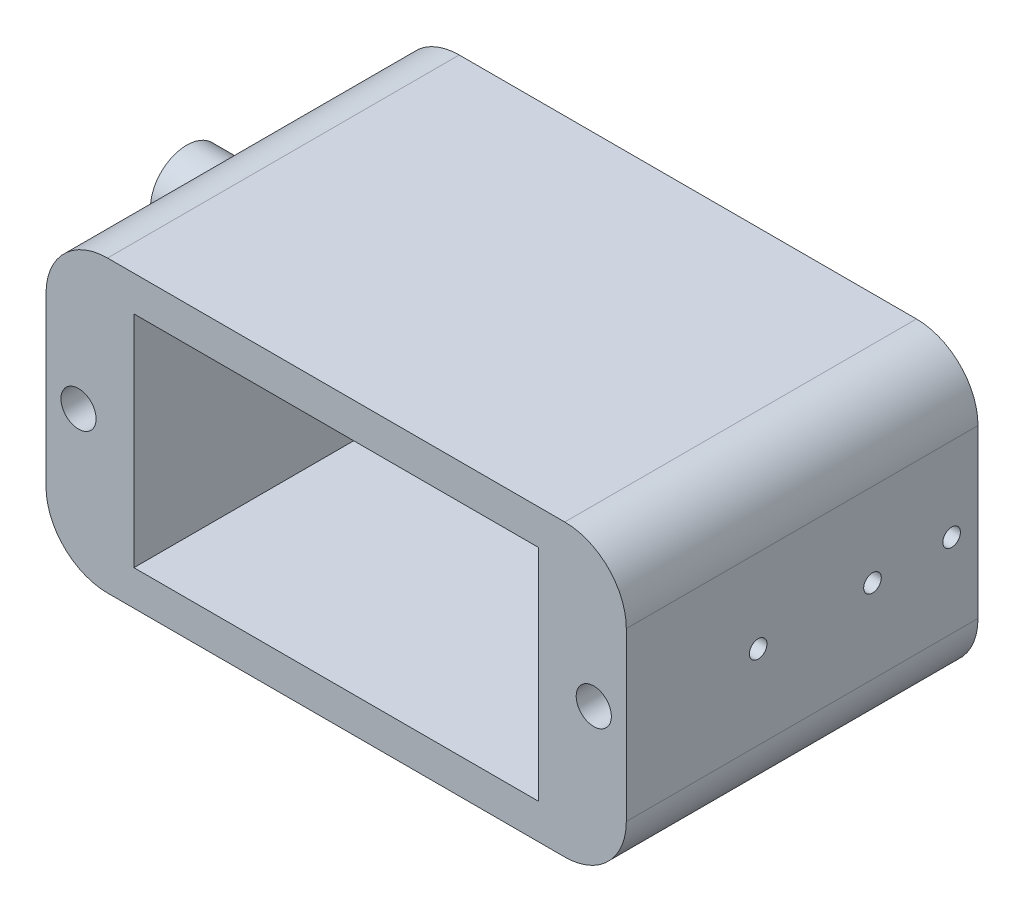
ISO-10303-21;
HEADER;
FILE_DESCRIPTION(('STEP AP214'),'2;1');
FILE_NAME('part.step','',(''),(''),'','','');
FILE_SCHEMA(('AUTOMOTIVE_DESIGN { 1 0 10303 214 1 1 1 1 }'));
ENDSEC;
DATA;
#1=APPLICATION_CONTEXT('core data for automotive mechanical design processes');
#2=APPLICATION_PROTOCOL_DEFINITION('international standard','automotive_design',2000,#1);
#3=PRODUCT_CONTEXT('',#1,'mechanical');
#4=PRODUCT('Part','Part','',(#3));
#5=PRODUCT_RELATED_PRODUCT_CATEGORY('part','',(#4));
#6=PRODUCT_DEFINITION_FORMATION('','',#4);
#7=PRODUCT_DEFINITION_CONTEXT('part definition',#1,'design');
#8=PRODUCT_DEFINITION('design','',#6,#7);
#9=PRODUCT_DEFINITION_SHAPE('','',#8);
#10=(LENGTH_UNIT() NAMED_UNIT(*) SI_UNIT(.MILLI.,.METRE.));
#11=(NAMED_UNIT(*) PLANE_ANGLE_UNIT() SI_UNIT($,.RADIAN.));
#12=(NAMED_UNIT(*) SI_UNIT($,.STERADIAN.) SOLID_ANGLE_UNIT());
#13=UNCERTAINTY_MEASURE_WITH_UNIT(LENGTH_MEASURE(1.E-05),#10,'distance_accuracy_value','');
#14=(GEOMETRIC_REPRESENTATION_CONTEXT(3) GLOBAL_UNCERTAINTY_ASSIGNED_CONTEXT((#13)) GLOBAL_UNIT_ASSIGNED_CONTEXT((#10,
#11,#12)) REPRESENTATION_CONTEXT('',''));
#15=CARTESIAN_POINT('',(0.,0.,0.));
#16=DIRECTION('',(0.,0.,1.));
#17=DIRECTION('',(1.,0.,0.));
#18=AXIS2_PLACEMENT_3D('',#15,#16,#17);
#19=CARTESIAN_POINT('',(0.,0.,16.));
#20=DIRECTION('',(0.,0.,-1.));
#21=DIRECTION('',(-1.,0.,0.));
#22=AXIS2_PLACEMENT_3D('',#19,#20,#21);
#23=PLANE('',#22);
#24=CARTESIAN_POINT('',(-14.65,0.,16.));
#25=DIRECTION('',(0.,0.,1.));
#26=DIRECTION('',(1.,0.,0.));
#27=AXIS2_PLACEMENT_3D('',#24,#25,#26);
#28=CIRCLE('',#27,1.);
#29=CARTESIAN_POINT('',(-13.65,0.,16.));
#30=VERTEX_POINT('',#29);
#31=EDGE_CURVE('E250',#30,#30,#28,.T.);
#32=ORIENTED_EDGE('',*,*,#31,.F.);
#33=EDGE_LOOP('',(#32));
#34=FACE_BOUND('',#33,.T.);
#35=CARTESIAN_POINT('',(14.65,0.,16.));
#36=DIRECTION('',(0.,0.,1.));
#37=DIRECTION('',(-1.,0.,0.));
#38=AXIS2_PLACEMENT_3D('',#35,#36,#37);
#39=CIRCLE('',#38,1.);
#40=CARTESIAN_POINT('',(13.65,0.,16.));
#41=VERTEX_POINT('',#40);
#42=EDGE_CURVE('E244',#41,#41,#39,.T.);
#43=ORIENTED_EDGE('',*,*,#42,.F.);
#44=EDGE_LOOP('',(#43));
#45=FACE_BOUND('',#44,.T.);
#46=DIRECTION('',(0.,1.,0.));
#47=VECTOR('',#46,1.);
#48=CARTESIAN_POINT('',(16.5,-8.25,16.));
#49=LINE('',#48,#47);
#50=CARTESIAN_POINT('',(16.5,-4.75,16.));
#51=VERTEX_POINT('',#50);
#52=CARTESIAN_POINT('',(16.5,4.75,16.));
#53=VERTEX_POINT('',#52);
#54=EDGE_CURVE('E306',#51,#53,#49,.T.);
#55=ORIENTED_EDGE('',*,*,#54,.T.);
#56=CARTESIAN_POINT('',(13.,4.75,16.));
#57=DIRECTION('',(0.,0.,-1.));
#58=DIRECTION('',(-1.,0.,0.));
#59=AXIS2_PLACEMENT_3D('',#56,#57,#58);
#60=CIRCLE('',#59,3.5);
#61=CARTESIAN_POINT('',(13.,8.25,16.));
#62=VERTEX_POINT('',#61);
#63=EDGE_CURVE('E365',#53,#62,#60,.F.);
#64=ORIENTED_EDGE('',*,*,#63,.T.);
#65=DIRECTION('',(-1.,0.,0.));
#66=VECTOR('',#65,1.);
#67=CARTESIAN_POINT('',(-16.5,8.25,16.));
#68=LINE('',#67,#66);
#69=CARTESIAN_POINT('',(-13.,8.25,16.));
#70=VERTEX_POINT('',#69);
#71=EDGE_CURVE('E310',#62,#70,#68,.T.);
#72=ORIENTED_EDGE('',*,*,#71,.T.);
#73=CARTESIAN_POINT('',(-13.,4.75,16.));
#74=DIRECTION('',(0.,0.,-1.));
#75=DIRECTION('',(-1.,0.,0.));
#76=AXIS2_PLACEMENT_3D('',#73,#74,#75);
#77=CIRCLE('',#76,3.5);
#78=CARTESIAN_POINT('',(-16.5,4.75,16.));
#79=VERTEX_POINT('',#78);
#80=EDGE_CURVE('E362',#70,#79,#77,.F.);
#81=ORIENTED_EDGE('',*,*,#80,.T.);
#82=DIRECTION('',(0.,-1.,0.));
#83=VECTOR('',#82,1.);
#84=CARTESIAN_POINT('',(-16.5,-8.25,16.));
#85=LINE('',#84,#83);
#86=CARTESIAN_POINT('',(-16.5,-4.75,16.));
#87=VERTEX_POINT('',#86);
#88=EDGE_CURVE('E314',#79,#87,#85,.T.);
#89=ORIENTED_EDGE('',*,*,#88,.T.);
#90=CARTESIAN_POINT('',(-13.,-4.75,16.));
#91=DIRECTION('',(0.,0.,-1.));
#92=DIRECTION('',(-1.,0.,0.));
#93=AXIS2_PLACEMENT_3D('',#90,#91,#92);
#94=CIRCLE('',#93,3.5);
#95=CARTESIAN_POINT('',(-13.,-8.25,16.));
#96=VERTEX_POINT('',#95);
#97=EDGE_CURVE('E60',#87,#96,#94,.F.);
#98=ORIENTED_EDGE('',*,*,#97,.T.);
#99=DIRECTION('',(1.,0.,0.));
#100=VECTOR('',#99,1.);
#101=CARTESIAN_POINT('',(-16.5,-8.25,16.));
#102=LINE('',#101,#100);
#103=CARTESIAN_POINT('',(13.,-8.25,16.));
#104=VERTEX_POINT('',#103);
#105=EDGE_CURVE('E317',#96,#104,#102,.T.);
#106=ORIENTED_EDGE('',*,*,#105,.T.);
#107=CARTESIAN_POINT('',(13.,-4.75,16.));
#108=DIRECTION('',(0.,0.,-1.));
#109=DIRECTION('',(-1.,0.,0.));
#110=AXIS2_PLACEMENT_3D('',#107,#108,#109);
#111=CIRCLE('',#110,3.5);
#112=EDGE_CURVE('E357',#104,#51,#111,.F.);
#113=ORIENTED_EDGE('',*,*,#112,.T.);
#114=EDGE_LOOP('',(#55,#64,#72,#81,#89,#98,#106,#113));
#115=FACE_BOUND('',#114,.T.);
#116=DIRECTION('',(0.,1.,0.));
#117=VECTOR('',#116,1.);
#118=CARTESIAN_POINT('',(11.5,-6.25,16.));
#119=LINE('',#118,#117);
#120=CARTESIAN_POINT('',(11.5,-6.25,16.));
#121=VERTEX_POINT('',#120);
#122=CARTESIAN_POINT('',(11.5,6.25,16.));
#123=VERTEX_POINT('',#122);
#124=EDGE_CURVE('E261',#121,#123,#119,.T.);
#125=ORIENTED_EDGE('',*,*,#124,.F.);
#126=DIRECTION('',(1.,0.,0.));
#127=VECTOR('',#126,1.);
#128=CARTESIAN_POINT('',(-11.5,-6.25,16.));
#129=LINE('',#128,#127);
#130=CARTESIAN_POINT('',(-11.5,-6.25,16.));
#131=VERTEX_POINT('',#130);
#132=EDGE_CURVE('E272',#131,#121,#129,.T.);
#133=ORIENTED_EDGE('',*,*,#132,.F.);
#134=DIRECTION('',(0.,-1.,0.));
#135=VECTOR('',#134,1.);
#136=CARTESIAN_POINT('',(-11.5,-6.25,16.));
#137=LINE('',#136,#135);
#138=CARTESIAN_POINT('',(-11.5,6.25,16.));
#139=VERTEX_POINT('',#138);
#140=EDGE_CURVE('E268',#139,#131,#137,.T.);
#141=ORIENTED_EDGE('',*,*,#140,.F.);
#142=DIRECTION('',(-1.,0.,0.));
#143=VECTOR('',#142,1.);
#144=CARTESIAN_POINT('',(-11.5,6.25,16.));
#145=LINE('',#144,#143);
#146=EDGE_CURVE('E264',#123,#139,#145,.T.);
#147=ORIENTED_EDGE('',*,*,#146,.F.);
#148=EDGE_LOOP('',(#125,#133,#141,#147));
#149=FACE_BOUND('',#148,.T.);
#150=ADVANCED_FACE('F38',(#34,#45,#115,#149),#23,.F.);
#151=CARTESIAN_POINT('',(16.5,-8.25,16.));
#152=DIRECTION('',(-1.,0.,0.));
#153=DIRECTION('',(0.,0.,1.));
#154=AXIS2_PLACEMENT_3D('',#151,#152,#153);
#155=PLANE('',#154);
#156=CARTESIAN_POINT('',(16.5,0.,8.5));
#157=DIRECTION('',(1.,0.,0.));
#158=DIRECTION('',(0.,0.,-1.));
#159=AXIS2_PLACEMENT_3D('',#156,#157,#158);
#160=CIRCLE('',#159,0.500000000000001);
#161=CARTESIAN_POINT('',(16.5,0.,8.));
#162=VERTEX_POINT('',#161);
#163=EDGE_CURVE('E759',#162,#162,#160,.T.);
#164=ORIENTED_EDGE('',*,*,#163,.F.);
#165=EDGE_LOOP('',(#164));
#166=FACE_BOUND('',#165,.T.);
#167=CARTESIAN_POINT('',(16.5,0.,-2.5));
#168=DIRECTION('',(1.,0.,0.));
#169=DIRECTION('',(0.,0.,-1.));
#170=AXIS2_PLACEMENT_3D('',#167,#168,#169);
#171=CIRCLE('',#170,0.5);
#172=CARTESIAN_POINT('',(16.5,0.,-3.));
#173=VERTEX_POINT('',#172);
#174=EDGE_CURVE('E751',#173,#173,#171,.T.);
#175=ORIENTED_EDGE('',*,*,#174,.F.);
#176=EDGE_LOOP('',(#175));
#177=FACE_BOUND('',#176,.T.);
#178=CARTESIAN_POINT('',(16.5,0.,2.));
#179=DIRECTION('',(1.,0.,0.));
#180=DIRECTION('',(0.,0.,-1.));
#181=AXIS2_PLACEMENT_3D('',#178,#179,#180);
#182=CIRCLE('',#181,0.500000000000001);
#183=CARTESIAN_POINT('',(16.5,0.,1.5));
#184=VERTEX_POINT('',#183);
#185=EDGE_CURVE('E195',#184,#184,#182,.T.);
#186=ORIENTED_EDGE('',*,*,#185,.F.);
#187=EDGE_LOOP('',(#186));
#188=FACE_BOUND('',#187,.T.);
#189=DIRECTION('',(0.,-1.,0.));
#190=VECTOR('',#189,1.);
#191=CARTESIAN_POINT('',(16.5,-8.25,-4.));
#192=LINE('',#191,#190);
#193=CARTESIAN_POINT('',(16.5,4.75,-4.));
#194=VERTEX_POINT('',#193);
#195=CARTESIAN_POINT('',(16.5,-4.75,-4.));
#196=VERTEX_POINT('',#195);
#197=EDGE_CURVE('E232',#194,#196,#192,.T.);
#198=ORIENTED_EDGE('',*,*,#197,.F.);
#199=DIRECTION('',(0.,0.,-1.));
#200=VECTOR('',#199,1.);
#201=CARTESIAN_POINT('',(16.5,4.75,16.));
#202=LINE('',#201,#200);
#203=EDGE_CURVE('E354',#194,#53,#202,.F.);
#204=ORIENTED_EDGE('',*,*,#203,.T.);
#205=ORIENTED_EDGE('',*,*,#54,.F.);
#206=DIRECTION('',(0.,0.,-1.));
#207=VECTOR('',#206,1.);
#208=CARTESIAN_POINT('',(16.5,-4.75,16.));
#209=LINE('',#208,#207);
#210=EDGE_CURVE('E350',#51,#196,#209,.T.);
#211=ORIENTED_EDGE('',*,*,#210,.T.);
#212=EDGE_LOOP('',(#198,#204,#205,#211));
#213=FACE_BOUND('',#212,.T.);
#214=ADVANCED_FACE('F423',(#166,#177,#188,#213),#155,.F.);
#215=CARTESIAN_POINT('',(-16.5,8.25,16.));
#216=DIRECTION('',(0.,-1.,0.));
#217=DIRECTION('',(0.,0.,-1.));
#218=AXIS2_PLACEMENT_3D('',#215,#216,#217);
#219=PLANE('',#218);
#220=ORIENTED_EDGE('',*,*,#71,.F.);
#221=DIRECTION('',(0.,0.,-1.));
#222=VECTOR('',#221,1.);
#223=CARTESIAN_POINT('',(13.,8.25,16.));
#224=LINE('',#223,#222);
#225=CARTESIAN_POINT('',(13.,8.25,-4.));
#226=VERTEX_POINT('',#225);
#227=EDGE_CURVE('E334',#62,#226,#224,.T.);
#228=ORIENTED_EDGE('',*,*,#227,.T.);
#229=DIRECTION('',(1.,0.,0.));
#230=VECTOR('',#229,1.);
#231=CARTESIAN_POINT('',(16.5,8.25,-4.));
#232=LINE('',#231,#230);
#233=CARTESIAN_POINT('',(-13.,8.25,-4.));
#234=VERTEX_POINT('',#233);
#235=EDGE_CURVE('E225',#234,#226,#232,.T.);
#236=ORIENTED_EDGE('',*,*,#235,.F.);
#237=DIRECTION('',(0.,0.,-1.));
#238=VECTOR('',#237,1.);
#239=CARTESIAN_POINT('',(-13.,8.25,16.));
#240=LINE('',#239,#238);
#241=EDGE_CURVE('E331',#234,#70,#240,.F.);
#242=ORIENTED_EDGE('',*,*,#241,.T.);
#243=EDGE_LOOP('',(#220,#228,#236,#242));
#244=FACE_BOUND('',#243,.T.);
#245=ADVANCED_FACE('F430',(#244),#219,.F.);
#246=CARTESIAN_POINT('',(-16.5,-8.25,16.));
#247=DIRECTION('',(1.,0.,0.));
#248=DIRECTION('',(0.,0.,-1.));
#249=AXIS2_PLACEMENT_3D('',#246,#247,#248);
#250=PLANE('',#249);
#251=CARTESIAN_POINT('',(-16.5,0.,2.));
#252=DIRECTION('',(1.,0.,0.));
#253=DIRECTION('',(0.,0.,-1.));
#254=AXIS2_PLACEMENT_3D('',#251,#252,#253);
#255=CIRCLE('',#254,2.06);
#256=CARTESIAN_POINT('',(-16.5,0.,-0.0600000000000002));
#257=VERTEX_POINT('',#256);
#258=EDGE_CURVE('E320',#257,#257,#255,.F.);
#259=ORIENTED_EDGE('',*,*,#258,.F.);
#260=EDGE_LOOP('',(#259));
#261=FACE_BOUND('',#260,.T.);
#262=ORIENTED_EDGE('',*,*,#88,.F.);
#263=DIRECTION('',(0.,0.,-1.));
#264=VECTOR('',#263,1.);
#265=CARTESIAN_POINT('',(-16.5,4.75,16.));
#266=LINE('',#265,#264);
#267=CARTESIAN_POINT('',(-16.5,4.75,-4.));
#268=VERTEX_POINT('',#267);
#269=EDGE_CURVE('E371',#79,#268,#266,.T.);
#270=ORIENTED_EDGE('',*,*,#269,.T.);
#271=DIRECTION('',(0.,1.,0.));
#272=VECTOR('',#271,1.);
#273=CARTESIAN_POINT('',(-16.5,8.25,-4.));
#274=LINE('',#273,#272);
#275=CARTESIAN_POINT('',(-16.5,-4.75,-4.));
#276=VERTEX_POINT('',#275);
#277=EDGE_CURVE('E240',#276,#268,#274,.T.);
#278=ORIENTED_EDGE('',*,*,#277,.F.);
#279=DIRECTION('',(0.,0.,-1.));
#280=VECTOR('',#279,1.);
#281=CARTESIAN_POINT('',(-16.5,-4.75,16.));
#282=LINE('',#281,#280);
#283=EDGE_CURVE('E368',#276,#87,#282,.F.);
#284=ORIENTED_EDGE('',*,*,#283,.T.);
#285=EDGE_LOOP('',(#262,#270,#278,#284));
#286=FACE_BOUND('',#285,.T.);
#287=ADVANCED_FACE('F440',(#261,#286),#250,.F.);
#288=CARTESIAN_POINT('',(-16.5,-8.25,16.));
#289=DIRECTION('',(0.,1.,0.));
#290=DIRECTION('',(0.,0.,1.));
#291=AXIS2_PLACEMENT_3D('',#288,#289,#290);
#292=PLANE('',#291);
#293=ORIENTED_EDGE('',*,*,#105,.F.);
#294=DIRECTION('',(0.,0.,-1.));
#295=VECTOR('',#294,1.);
#296=CARTESIAN_POINT('',(-13.,-8.25,16.));
#297=LINE('',#296,#295);
#298=CARTESIAN_POINT('',(-13.,-8.24999999999999,-4.));
#299=VERTEX_POINT('',#298);
#300=EDGE_CURVE('E11',#96,#299,#297,.T.);
#301=ORIENTED_EDGE('',*,*,#300,.T.);
#302=DIRECTION('',(-1.,0.,0.));
#303=VECTOR('',#302,1.);
#304=CARTESIAN_POINT('',(11.5,-8.25,-4.));
#305=LINE('',#304,#303);
#306=CARTESIAN_POINT('',(13.,-8.25,-4.));
#307=VERTEX_POINT('',#306);
#308=EDGE_CURVE('E236',#307,#299,#305,.T.);
#309=ORIENTED_EDGE('',*,*,#308,.F.);
#310=DIRECTION('',(0.,0.,-1.));
#311=VECTOR('',#310,1.);
#312=CARTESIAN_POINT('',(13.,-8.25,16.));
#313=LINE('',#312,#311);
#314=EDGE_CURVE('E47',#307,#104,#313,.F.);
#315=ORIENTED_EDGE('',*,*,#314,.T.);
#316=EDGE_LOOP('',(#293,#301,#309,#315));
#317=FACE_BOUND('',#316,.T.);
#318=ADVANCED_FACE('F437',(#317),#292,.F.);
#319=CARTESIAN_POINT('',(11.5,-6.25,16.));
#320=DIRECTION('',(-1.,0.,0.));
#321=DIRECTION('',(0.,0.,1.));
#322=AXIS2_PLACEMENT_3D('',#319,#320,#321);
#323=PLANE('',#322);
#324=DIRECTION('',(0.,0.,-1.));
#325=VECTOR('',#324,1.);
#326=CARTESIAN_POINT('',(11.5,5.,7.));
#327=LINE('',#326,#325);
#328=CARTESIAN_POINT('',(11.5,5.,7.));
#329=VERTEX_POINT('',#328);
#330=CARTESIAN_POINT('',(11.5,5.,0.));
#331=VERTEX_POINT('',#330);
#332=EDGE_CURVE('E215',#329,#331,#327,.T.);
#333=ORIENTED_EDGE('',*,*,#332,.F.);
#334=DIRECTION('',(0.,1.,0.));
#335=VECTOR('',#334,1.);
#336=CARTESIAN_POINT('',(11.5,5.,7.));
#337=LINE('',#336,#335);
#338=CARTESIAN_POINT('',(11.5,-5.,7.));
#339=VERTEX_POINT('',#338);
#340=EDGE_CURVE('E183',#339,#329,#337,.T.);
#341=ORIENTED_EDGE('',*,*,#340,.F.);
#342=DIRECTION('',(0.,0.,-1.));
#343=VECTOR('',#342,1.);
#344=CARTESIAN_POINT('',(11.5,-5.,7.));
#345=LINE('',#344,#343);
#346=CARTESIAN_POINT('',(11.5,-5.,0.));
#347=VERTEX_POINT('',#346);
#348=EDGE_CURVE('E179',#339,#347,#345,.T.);
#349=ORIENTED_EDGE('',*,*,#348,.T.);
#350=DIRECTION('',(0.,1.,0.));
#351=VECTOR('',#350,1.);
#352=CARTESIAN_POINT('',(11.5,-6.25,0.));
#353=LINE('',#352,#351);
#354=CARTESIAN_POINT('',(11.5,-6.25,0.));
#355=VERTEX_POINT('',#354);
#356=EDGE_CURVE('E276',#355,#347,#353,.T.);
#357=ORIENTED_EDGE('',*,*,#356,.F.);
#358=DIRECTION('',(0.,0.,-1.));
#359=VECTOR('',#358,1.);
#360=CARTESIAN_POINT('',(11.5,-6.25,16.));
#361=LINE('',#360,#359);
#362=EDGE_CURVE('E275',#121,#355,#361,.T.);
#363=ORIENTED_EDGE('',*,*,#362,.F.);
#364=ORIENTED_EDGE('',*,*,#124,.T.);
#365=DIRECTION('',(0.,0.,-1.));
#366=VECTOR('',#365,1.);
#367=CARTESIAN_POINT('',(11.5,6.25,16.));
#368=LINE('',#367,#366);
#369=CARTESIAN_POINT('',(11.5,6.25,0.));
#370=VERTEX_POINT('',#369);
#371=EDGE_CURVE('E302',#123,#370,#368,.T.);
#372=ORIENTED_EDGE('',*,*,#371,.T.);
#373=EDGE_CURVE('E249',#331,#370,#353,.T.);
#374=ORIENTED_EDGE('',*,*,#373,.F.);
#375=EDGE_LOOP('',(#333,#341,#349,#357,#363,#364,#372,#374));
#376=FACE_BOUND('',#375,.T.);
#377=ADVANCED_FACE('F393',(#376),#323,.T.);
#378=CARTESIAN_POINT('',(-11.5,6.25,16.));
#379=DIRECTION('',(0.,-1.,0.));
#380=DIRECTION('',(0.,0.,-1.));
#381=AXIS2_PLACEMENT_3D('',#378,#379,#380);
#382=PLANE('',#381);
#383=DIRECTION('',(-1.,0.,0.));
#384=VECTOR('',#383,1.);
#385=CARTESIAN_POINT('',(-11.5,6.25,0.));
#386=LINE('',#385,#384);
#387=CARTESIAN_POINT('',(-11.5,6.25,0.));
#388=VERTEX_POINT('',#387);
#389=EDGE_CURVE('E280',#370,#388,#386,.T.);
#390=ORIENTED_EDGE('',*,*,#389,.F.);
#391=ORIENTED_EDGE('',*,*,#371,.F.);
#392=ORIENTED_EDGE('',*,*,#146,.T.);
#393=DIRECTION('',(0.,0.,-1.));
#394=VECTOR('',#393,1.);
#395=CARTESIAN_POINT('',(-11.5,6.25,16.));
#396=LINE('',#395,#394);
#397=EDGE_CURVE('E299',#139,#388,#396,.T.);
#398=ORIENTED_EDGE('',*,*,#397,.T.);
#399=EDGE_LOOP('',(#390,#391,#392,#398));
#400=FACE_BOUND('',#399,.T.);
#401=ADVANCED_FACE('F408',(#400),#382,.T.);
#402=CARTESIAN_POINT('',(-11.5,-6.25,16.));
#403=DIRECTION('',(1.,0.,0.));
#404=DIRECTION('',(0.,0.,-1.));
#405=AXIS2_PLACEMENT_3D('',#402,#403,#404);
#406=PLANE('',#405);
#407=DIRECTION('',(0.,-1.,0.));
#408=VECTOR('',#407,1.);
#409=CARTESIAN_POINT('',(-11.5,-6.25,0.));
#410=LINE('',#409,#408);
#411=CARTESIAN_POINT('',(-11.5,-6.25,0.));
#412=VERTEX_POINT('',#411);
#413=EDGE_CURVE('E285',#388,#412,#410,.T.);
#414=ORIENTED_EDGE('',*,*,#413,.F.);
#415=ORIENTED_EDGE('',*,*,#397,.F.);
#416=ORIENTED_EDGE('',*,*,#140,.T.);
#417=DIRECTION('',(0.,0.,-1.));
#418=VECTOR('',#417,1.);
#419=CARTESIAN_POINT('',(-11.5,-6.25,16.));
#420=LINE('',#419,#418);
#421=EDGE_CURVE('E295',#131,#412,#420,.T.);
#422=ORIENTED_EDGE('',*,*,#421,.T.);
#423=EDGE_LOOP('',(#414,#415,#416,#422));
#424=FACE_BOUND('',#423,.T.);
#425=ADVANCED_FACE('F412',(#424),#406,.T.);
#426=CARTESIAN_POINT('',(-11.5,-6.25,16.));
#427=DIRECTION('',(0.,1.,0.));
#428=DIRECTION('',(0.,0.,1.));
#429=AXIS2_PLACEMENT_3D('',#426,#427,#428);
#430=PLANE('',#429);
#431=DIRECTION('',(1.,0.,0.));
#432=VECTOR('',#431,1.);
#433=CARTESIAN_POINT('',(-11.5,-6.25,0.));
#434=LINE('',#433,#432);
#435=EDGE_CURVE('E265',#412,#355,#434,.T.);
#436=ORIENTED_EDGE('',*,*,#435,.F.);
#437=ORIENTED_EDGE('',*,*,#421,.F.);
#438=ORIENTED_EDGE('',*,*,#132,.T.);
#439=ORIENTED_EDGE('',*,*,#362,.T.);
#440=EDGE_LOOP('',(#436,#437,#438,#439));
#441=FACE_BOUND('',#440,.T.);
#442=ADVANCED_FACE('F402',(#441),#430,.T.);
#443=CARTESIAN_POINT('',(14.65,0.,12.));
#444=DIRECTION('',(0.,0.,1.));
#445=DIRECTION('',(1.,0.,0.));
#446=AXIS2_PLACEMENT_3D('',#443,#444,#445);
#447=CYLINDRICAL_SURFACE('',#446,1.);
#448=CARTESIAN_POINT('',(14.65,0.,12.));
#449=DIRECTION('',(0.,0.,1.));
#450=DIRECTION('',(-1.,0.,0.));
#451=AXIS2_PLACEMENT_3D('',#448,#449,#450);
#452=CIRCLE('',#451,1.);
#453=CARTESIAN_POINT('',(13.65,0.,12.));
#454=VERTEX_POINT('',#453);
#455=EDGE_CURVE('E254',#454,#454,#452,.T.);
#456=ORIENTED_EDGE('',*,*,#455,.F.);
#457=EDGE_LOOP('',(#456));
#458=FACE_BOUND('',#457,.T.);
#459=ORIENTED_EDGE('',*,*,#42,.T.);
#460=EDGE_LOOP('',(#459));
#461=FACE_BOUND('',#460,.T.);
#462=ADVANCED_FACE('F419',(#458,#461),#447,.F.);
#463=CARTESIAN_POINT('',(14.65,0.,12.));
#464=DIRECTION('',(0.,0.,-1.));
#465=DIRECTION('',(-1.,0.,0.));
#466=AXIS2_PLACEMENT_3D('',#463,#464,#465);
#467=PLANE('',#466);
#468=ORIENTED_EDGE('',*,*,#455,.T.);
#469=EDGE_LOOP('',(#468));
#470=FACE_BOUND('',#469,.T.);
#471=ADVANCED_FACE('F503',(#470),#467,.F.);
#472=CARTESIAN_POINT('',(-14.65,0.,12.));
#473=DIRECTION('',(0.,0.,1.));
#474=DIRECTION('',(1.,0.,0.));
#475=AXIS2_PLACEMENT_3D('',#472,#473,#474);
#476=CYLINDRICAL_SURFACE('',#475,1.);
#477=CARTESIAN_POINT('',(-14.65,0.,12.));
#478=DIRECTION('',(0.,0.,1.));
#479=DIRECTION('',(1.,0.,0.));
#480=AXIS2_PLACEMENT_3D('',#477,#478,#479);
#481=CIRCLE('',#480,1.);
#482=CARTESIAN_POINT('',(-13.65,0.,12.));
#483=VERTEX_POINT('',#482);
#484=EDGE_CURVE('E245',#483,#483,#481,.T.);
#485=ORIENTED_EDGE('',*,*,#484,.F.);
#486=EDGE_LOOP('',(#485));
#487=FACE_BOUND('',#486,.T.);
#488=ORIENTED_EDGE('',*,*,#31,.T.);
#489=EDGE_LOOP('',(#488));
#490=FACE_BOUND('',#489,.T.);
#491=ADVANCED_FACE('F499',(#487,#490),#476,.F.);
#492=CARTESIAN_POINT('',(-14.65,0.,12.));
#493=DIRECTION('',(0.,0.,1.));
#494=DIRECTION('',(1.,0.,0.));
#495=AXIS2_PLACEMENT_3D('',#492,#493,#494);
#496=PLANE('',#495);
#497=ORIENTED_EDGE('',*,*,#484,.T.);
#498=EDGE_LOOP('',(#497));
#499=FACE_BOUND('',#498,.T.);
#500=ADVANCED_FACE('F482',(#499),#496,.T.);
#501=CARTESIAN_POINT('',(0.,0.,-4.));
#502=DIRECTION('',(0.,0.,1.));
#503=DIRECTION('',(1.,0.,0.));
#504=AXIS2_PLACEMENT_3D('',#501,#502,#503);
#505=PLANE('',#504);
#506=DIRECTION('',(-1.,0.,0.));
#507=VECTOR('',#506,1.);
#508=CARTESIAN_POINT('',(14.5,-5.,-4.));
#509=LINE('',#508,#507);
#510=CARTESIAN_POINT('',(14.5,-5.,-4.));
#511=VERTEX_POINT('',#510);
#512=CARTESIAN_POINT('',(11.5,-5.,-4.));
#513=VERTEX_POINT('',#512);
#514=EDGE_CURVE('E204',#511,#513,#509,.T.);
#515=ORIENTED_EDGE('',*,*,#514,.F.);
#516=DIRECTION('',(0.,-1.,0.));
#517=VECTOR('',#516,1.);
#518=CARTESIAN_POINT('',(14.5,5.,-4.));
#519=LINE('',#518,#517);
#520=CARTESIAN_POINT('',(14.5,5.,-4.));
#521=VERTEX_POINT('',#520);
#522=EDGE_CURVE('E166',#521,#511,#519,.T.);
#523=ORIENTED_EDGE('',*,*,#522,.F.);
#524=DIRECTION('',(1.,0.,0.));
#525=VECTOR('',#524,1.);
#526=CARTESIAN_POINT('',(14.5,5.,-4.));
#527=LINE('',#526,#525);
#528=CARTESIAN_POINT('',(11.5,5.,-4.));
#529=VERTEX_POINT('',#528);
#530=EDGE_CURVE('E188',#529,#521,#527,.T.);
#531=ORIENTED_EDGE('',*,*,#530,.F.);
#532=DIRECTION('',(0.,1.,0.));
#533=VECTOR('',#532,1.);
#534=CARTESIAN_POINT('',(11.5,5.,-4.));
#535=LINE('',#534,#533);
#536=EDGE_CURVE('E192',#513,#529,#535,.T.);
#537=ORIENTED_EDGE('',*,*,#536,.F.);
#538=EDGE_LOOP('',(#515,#523,#531,#537));
#539=FACE_BOUND('',#538,.T.);
#540=ORIENTED_EDGE('',*,*,#235,.T.);
#541=CARTESIAN_POINT('',(13.,4.75,-4.));
#542=DIRECTION('',(0.,0.,1.));
#543=DIRECTION('',(1.,0.,0.));
#544=AXIS2_PLACEMENT_3D('',#541,#542,#543);
#545=CIRCLE('',#544,3.5);
#546=EDGE_CURVE('E347',#226,#194,#545,.F.);
#547=ORIENTED_EDGE('',*,*,#546,.T.);
#548=ORIENTED_EDGE('',*,*,#197,.T.);
#549=CARTESIAN_POINT('',(13.,-4.75,-4.));
#550=DIRECTION('',(0.,0.,1.));
#551=DIRECTION('',(1.,0.,0.));
#552=AXIS2_PLACEMENT_3D('',#549,#550,#551);
#553=CIRCLE('',#552,3.5);
#554=EDGE_CURVE('E338',#196,#307,#553,.F.);
#555=ORIENTED_EDGE('',*,*,#554,.T.);
#556=ORIENTED_EDGE('',*,*,#308,.T.);
#557=CARTESIAN_POINT('',(-13.,-4.75,-4.));
#558=DIRECTION('',(0.,0.,1.));
#559=DIRECTION('',(1.,0.,0.));
#560=AXIS2_PLACEMENT_3D('',#557,#558,#559);
#561=CIRCLE('',#560,3.5);
#562=EDGE_CURVE('E341',#299,#276,#561,.F.);
#563=ORIENTED_EDGE('',*,*,#562,.T.);
#564=ORIENTED_EDGE('',*,*,#277,.T.);
#565=CARTESIAN_POINT('',(-13.,4.75,-4.));
#566=DIRECTION('',(0.,0.,1.));
#567=DIRECTION('',(1.,0.,0.));
#568=AXIS2_PLACEMENT_3D('',#565,#566,#567);
#569=CIRCLE('',#568,3.5);
#570=EDGE_CURVE('E344',#268,#234,#569,.F.);
#571=ORIENTED_EDGE('',*,*,#570,.T.);
#572=EDGE_LOOP('',(#540,#547,#548,#555,#556,#563,#564,#571));
#573=FACE_BOUND('',#572,.T.);
#574=CARTESIAN_POINT('',(5.175,0.,-4.));
#575=DIRECTION('',(0.,0.,-1.));
#576=DIRECTION('',(-1.,0.,0.));
#577=AXIS2_PLACEMENT_3D('',#574,#575,#576);
#578=CIRCLE('',#577,4.575);
#579=CARTESIAN_POINT('',(0.599999999999999,0.,-4.));
#580=VERTEX_POINT('',#579);
#581=EDGE_CURVE('E221',#580,#580,#578,.T.);
#582=ORIENTED_EDGE('',*,*,#581,.F.);
#583=EDGE_LOOP('',(#582));
#584=FACE_BOUND('',#583,.T.);
#585=ADVANCED_FACE('F386',(#539,#573,#584),#505,.F.);
#586=CARTESIAN_POINT('',(0.,0.,0.));
#587=DIRECTION('',(0.,0.,1.));
#588=DIRECTION('',(1.,0.,0.));
#589=AXIS2_PLACEMENT_3D('',#586,#587,#588);
#590=PLANE('',#589);
#591=ORIENTED_EDGE('',*,*,#413,.T.);
#592=ORIENTED_EDGE('',*,*,#435,.T.);
#593=ORIENTED_EDGE('',*,*,#356,.T.);
#594=EDGE_CURVE('E281',#347,#331,#353,.T.);
#595=ORIENTED_EDGE('',*,*,#594,.T.);
#596=ORIENTED_EDGE('',*,*,#373,.T.);
#597=ORIENTED_EDGE('',*,*,#389,.T.);
#598=EDGE_LOOP('',(#591,#592,#593,#595,#596,#597));
#599=FACE_BOUND('',#598,.T.);
#600=CARTESIAN_POINT('',(5.175,0.,0.));
#601=DIRECTION('',(0.,0.,-1.));
#602=DIRECTION('',(-1.,0.,0.));
#603=AXIS2_PLACEMENT_3D('',#600,#601,#602);
#604=CIRCLE('',#603,4.575);
#605=CARTESIAN_POINT('',(0.599999999999999,0.,0.));
#606=VERTEX_POINT('',#605);
#607=EDGE_CURVE('E214',#606,#606,#604,.T.);
#608=ORIENTED_EDGE('',*,*,#607,.T.);
#609=EDGE_LOOP('',(#608));
#610=FACE_BOUND('',#609,.T.);
#611=ADVANCED_FACE('F397',(#599,#610),#590,.T.);
#612=CARTESIAN_POINT('',(5.175,0.,-4.));
#613=DIRECTION('',(0.,0.,1.));
#614=DIRECTION('',(1.,0.,0.));
#615=AXIS2_PLACEMENT_3D('',#612,#613,#614);
#616=CYLINDRICAL_SURFACE('',#615,4.575);
#617=ORIENTED_EDGE('',*,*,#581,.T.);
#618=EDGE_LOOP('',(#617));
#619=FACE_BOUND('',#618,.T.);
#620=ORIENTED_EDGE('',*,*,#607,.F.);
#621=EDGE_LOOP('',(#620));
#622=FACE_BOUND('',#621,.T.);
#623=ADVANCED_FACE('F486',(#619,#622),#616,.F.);
#624=CARTESIAN_POINT('',(14.5,5.,7.));
#625=DIRECTION('',(1.,0.,0.));
#626=DIRECTION('',(0.,1.,0.));
#627=AXIS2_PLACEMENT_3D('',#624,#625,#626);
#628=PLANE('',#627);
#629=CARTESIAN_POINT('',(14.5,0.,-2.5));
#630=DIRECTION('',(1.,0.,0.));
#631=DIRECTION('',(0.,1.,0.));
#632=AXIS2_PLACEMENT_3D('',#629,#630,#631);
#633=CIRCLE('',#632,0.5);
#634=CARTESIAN_POINT('',(14.5,0.5,-2.5));
#635=VERTEX_POINT('',#634);
#636=EDGE_CURVE('E205',#635,#635,#633,.T.);
#637=ORIENTED_EDGE('',*,*,#636,.T.);
#638=EDGE_LOOP('',(#637));
#639=FACE_BOUND('',#638,.T.);
#640=CARTESIAN_POINT('',(14.5,0.,2.));
#641=DIRECTION('',(1.,0.,0.));
#642=DIRECTION('',(0.,1.,0.));
#643=AXIS2_PLACEMENT_3D('',#640,#641,#642);
#644=CIRCLE('',#643,0.500000000000001);
#645=CARTESIAN_POINT('',(14.5,0.500000000000001,2.));
#646=VERTEX_POINT('',#645);
#647=EDGE_CURVE('E321',#646,#646,#644,.T.);
#648=ORIENTED_EDGE('',*,*,#647,.T.);
#649=EDGE_LOOP('',(#648));
#650=FACE_BOUND('',#649,.T.);
#651=ORIENTED_EDGE('',*,*,#522,.T.);
#652=DIRECTION('',(0.,0.,-1.));
#653=VECTOR('',#652,1.);
#654=CARTESIAN_POINT('',(14.5,-5.,7.));
#655=LINE('',#654,#653);
#656=CARTESIAN_POINT('',(14.5,-5.,7.));
#657=VERTEX_POINT('',#656);
#658=EDGE_CURVE('E159',#657,#511,#655,.T.);
#659=ORIENTED_EDGE('',*,*,#658,.F.);
#660=DIRECTION('',(0.,-1.,0.));
#661=VECTOR('',#660,1.);
#662=CARTESIAN_POINT('',(14.5,5.,7.));
#663=LINE('',#662,#661);
#664=CARTESIAN_POINT('',(14.5,5.,7.));
#665=VERTEX_POINT('',#664);
#666=EDGE_CURVE('E163',#665,#657,#663,.T.);
#667=ORIENTED_EDGE('',*,*,#666,.F.);
#668=DIRECTION('',(0.,0.,-1.));
#669=VECTOR('',#668,1.);
#670=CARTESIAN_POINT('',(14.5,5.,7.));
#671=LINE('',#670,#669);
#672=EDGE_CURVE('E211',#665,#521,#671,.T.);
#673=ORIENTED_EDGE('',*,*,#672,.T.);
#674=EDGE_LOOP('',(#651,#659,#667,#673));
#675=FACE_BOUND('',#674,.T.);
#676=ADVANCED_FACE('F161',(#639,#650,#675),#628,.F.);
#677=CARTESIAN_POINT('',(14.5,5.,7.));
#678=DIRECTION('',(0.,1.,0.));
#679=DIRECTION('',(0.,0.,1.));
#680=AXIS2_PLACEMENT_3D('',#677,#678,#679);
#681=PLANE('',#680);
#682=ORIENTED_EDGE('',*,*,#530,.T.);
#683=ORIENTED_EDGE('',*,*,#672,.F.);
#684=DIRECTION('',(1.,0.,0.));
#685=VECTOR('',#684,1.);
#686=CARTESIAN_POINT('',(14.5,5.,7.));
#687=LINE('',#686,#685);
#688=EDGE_CURVE('E172',#329,#665,#687,.T.);
#689=ORIENTED_EDGE('',*,*,#688,.F.);
#690=ORIENTED_EDGE('',*,*,#332,.T.);
#691=EDGE_CURVE('E218',#331,#529,#327,.T.);
#692=ORIENTED_EDGE('',*,*,#691,.T.);
#693=EDGE_LOOP('',(#682,#683,#689,#690,#692));
#694=FACE_BOUND('',#693,.T.);
#695=ADVANCED_FACE('F389',(#694),#681,.F.);
#696=CARTESIAN_POINT('',(11.5,5.,7.));
#697=DIRECTION('',(-1.,0.,0.));
#698=DIRECTION('',(0.,-1.,0.));
#699=AXIS2_PLACEMENT_3D('',#696,#697,#698);
#700=PLANE('',#699);
#701=ORIENTED_EDGE('',*,*,#594,.F.);
#702=EDGE_CURVE('E171',#347,#513,#345,.T.);
#703=ORIENTED_EDGE('',*,*,#702,.T.);
#704=ORIENTED_EDGE('',*,*,#536,.T.);
#705=ORIENTED_EDGE('',*,*,#691,.F.);
#706=EDGE_LOOP('',(#701,#703,#704,#705));
#707=FACE_BOUND('',#706,.T.);
#708=ADVANCED_FACE('F381',(#707),#700,.F.);
#709=CARTESIAN_POINT('',(14.5,-5.,7.));
#710=DIRECTION('',(0.,-1.,0.));
#711=DIRECTION('',(0.,0.,-1.));
#712=AXIS2_PLACEMENT_3D('',#709,#710,#711);
#713=PLANE('',#712);
#714=ORIENTED_EDGE('',*,*,#514,.T.);
#715=ORIENTED_EDGE('',*,*,#702,.F.);
#716=ORIENTED_EDGE('',*,*,#348,.F.);
#717=DIRECTION('',(-1.,0.,0.));
#718=VECTOR('',#717,1.);
#719=CARTESIAN_POINT('',(14.5,-5.,7.));
#720=LINE('',#719,#718);
#721=EDGE_CURVE('E175',#657,#339,#720,.T.);
#722=ORIENTED_EDGE('',*,*,#721,.F.);
#723=ORIENTED_EDGE('',*,*,#658,.T.);
#724=EDGE_LOOP('',(#714,#715,#716,#722,#723));
#725=FACE_BOUND('',#724,.T.);
#726=ADVANCED_FACE('F176',(#725),#713,.F.);
#727=CARTESIAN_POINT('',(0.,0.,7.));
#728=DIRECTION('',(0.,0.,-1.));
#729=DIRECTION('',(-1.,0.,0.));
#730=AXIS2_PLACEMENT_3D('',#727,#728,#729);
#731=PLANE('',#730);
#732=ORIENTED_EDGE('',*,*,#666,.T.);
#733=ORIENTED_EDGE('',*,*,#721,.T.);
#734=ORIENTED_EDGE('',*,*,#340,.T.);
#735=ORIENTED_EDGE('',*,*,#688,.T.);
#736=EDGE_LOOP('',(#732,#733,#734,#735));
#737=FACE_BOUND('',#736,.T.);
#738=ADVANCED_FACE('F185',(#737),#731,.T.);
#739=CARTESIAN_POINT('',(12.5,0.,2.));
#740=DIRECTION('',(1.,0.,0.));
#741=DIRECTION('',(0.,0.,-1.));
#742=AXIS2_PLACEMENT_3D('',#739,#740,#741);
#743=CYLINDRICAL_SURFACE('',#742,0.500000000000001);
#744=ORIENTED_EDGE('',*,*,#185,.T.);
#745=EDGE_LOOP('',(#744));
#746=FACE_BOUND('',#745,.T.);
#747=ORIENTED_EDGE('',*,*,#647,.F.);
#748=EDGE_LOOP('',(#747));
#749=FACE_BOUND('',#748,.T.);
#750=ADVANCED_FACE('F598',(#746,#749),#743,.F.);
#751=CARTESIAN_POINT('',(12.5,0.,-2.5));
#752=DIRECTION('',(1.,0.,0.));
#753=DIRECTION('',(0.,0.,-1.));
#754=AXIS2_PLACEMENT_3D('',#751,#752,#753);
#755=CYLINDRICAL_SURFACE('',#754,0.5);
#756=ORIENTED_EDGE('',*,*,#174,.T.);
#757=EDGE_LOOP('',(#756));
#758=FACE_BOUND('',#757,.T.);
#759=ORIENTED_EDGE('',*,*,#636,.F.);
#760=EDGE_LOOP('',(#759));
#761=FACE_BOUND('',#760,.T.);
#762=ADVANCED_FACE('F590',(#758,#761),#755,.F.);
#763=CARTESIAN_POINT('',(12.5,0.,8.5));
#764=DIRECTION('',(1.,0.,0.));
#765=DIRECTION('',(0.,0.,-1.));
#766=AXIS2_PLACEMENT_3D('',#763,#764,#765);
#767=CYLINDRICAL_SURFACE('',#766,0.500000000000001);
#768=CARTESIAN_POINT('',(12.5,0.,8.5));
#769=DIRECTION('',(1.,0.,0.));
#770=DIRECTION('',(0.,0.,-1.));
#771=AXIS2_PLACEMENT_3D('',#768,#769,#770);
#772=CIRCLE('',#771,0.500000000000001);
#773=CARTESIAN_POINT('',(12.5,0.,8.));
#774=VERTEX_POINT('',#773);
#775=EDGE_CURVE('E754',#774,#774,#772,.T.);
#776=ORIENTED_EDGE('',*,*,#775,.F.);
#777=EDGE_LOOP('',(#776));
#778=FACE_BOUND('',#777,.T.);
#779=ORIENTED_EDGE('',*,*,#163,.T.);
#780=EDGE_LOOP('',(#779));
#781=FACE_BOUND('',#780,.T.);
#782=ADVANCED_FACE('F582',(#778,#781),#767,.F.);
#783=CARTESIAN_POINT('',(12.5,0.,8.5));
#784=DIRECTION('',(1.,0.,0.));
#785=DIRECTION('',(0.,0.,-1.));
#786=AXIS2_PLACEMENT_3D('',#783,#784,#785);
#787=PLANE('',#786);
#788=ORIENTED_EDGE('',*,*,#775,.T.);
#789=EDGE_LOOP('',(#788));
#790=FACE_BOUND('',#789,.T.);
#791=ADVANCED_FACE('F574',(#790),#787,.T.);
#792=CARTESIAN_POINT('',(-22.5,0.,2.));
#793=DIRECTION('',(1.,0.,0.));
#794=DIRECTION('',(0.,0.,-1.));
#795=AXIS2_PLACEMENT_3D('',#792,#793,#794);
#796=CYLINDRICAL_SURFACE('',#795,2.06);
#797=CARTESIAN_POINT('',(-22.5,0.,2.));
#798=DIRECTION('',(-1.,0.,0.));
#799=DIRECTION('',(0.,0.,1.));
#800=AXIS2_PLACEMENT_3D('',#797,#798,#799);
#801=CIRCLE('',#800,2.06);
#802=CARTESIAN_POINT('',(-22.5,0.,4.06));
#803=VERTEX_POINT('',#802);
#804=EDGE_CURVE('E762',#803,#803,#801,.T.);
#805=ORIENTED_EDGE('',*,*,#804,.F.);
#806=EDGE_LOOP('',(#805));
#807=FACE_BOUND('',#806,.T.);
#808=ORIENTED_EDGE('',*,*,#258,.T.);
#809=EDGE_LOOP('',(#808));
#810=FACE_BOUND('',#809,.T.);
#811=ADVANCED_FACE('F567',(#807,#810),#796,.T.);
#812=CARTESIAN_POINT('',(-22.5,0.,2.));
#813=DIRECTION('',(-1.,0.,0.));
#814=DIRECTION('',(0.,0.,1.));
#815=AXIS2_PLACEMENT_3D('',#812,#813,#814);
#816=PLANE('',#815);
#817=ORIENTED_EDGE('',*,*,#804,.T.);
#818=EDGE_LOOP('',(#817));
#819=FACE_BOUND('',#818,.T.);
#820=ADVANCED_FACE('F451',(#819),#816,.T.);
#821=CARTESIAN_POINT('',(13.,4.75,16.));
#822=DIRECTION('',(0.,0.,-1.));
#823=DIRECTION('',(-1.,0.,0.));
#824=AXIS2_PLACEMENT_3D('',#821,#822,#823);
#825=CYLINDRICAL_SURFACE('',#824,3.5);
#826=ORIENTED_EDGE('',*,*,#63,.F.);
#827=ORIENTED_EDGE('',*,*,#203,.F.);
#828=ORIENTED_EDGE('',*,*,#546,.F.);
#829=ORIENTED_EDGE('',*,*,#227,.F.);
#830=EDGE_LOOP('',(#826,#827,#828,#829));
#831=FACE_BOUND('',#830,.T.);
#832=ADVANCED_FACE('F447',(#831),#825,.T.);
#833=CARTESIAN_POINT('',(-13.,4.75,16.));
#834=DIRECTION('',(0.,0.,-1.));
#835=DIRECTION('',(-1.,0.,0.));
#836=AXIS2_PLACEMENT_3D('',#833,#834,#835);
#837=CYLINDRICAL_SURFACE('',#836,3.5);
#838=ORIENTED_EDGE('',*,*,#80,.F.);
#839=ORIENTED_EDGE('',*,*,#241,.F.);
#840=ORIENTED_EDGE('',*,*,#570,.F.);
#841=ORIENTED_EDGE('',*,*,#269,.F.);
#842=EDGE_LOOP('',(#838,#839,#840,#841));
#843=FACE_BOUND('',#842,.T.);
#844=ADVANCED_FACE('F450',(#843),#837,.T.);
#845=CARTESIAN_POINT('',(-13.,-4.75,16.));
#846=DIRECTION('',(0.,0.,-1.));
#847=DIRECTION('',(-1.,0.,0.));
#848=AXIS2_PLACEMENT_3D('',#845,#846,#847);
#849=CYLINDRICAL_SURFACE('',#848,3.5);
#850=ORIENTED_EDGE('',*,*,#97,.F.);
#851=ORIENTED_EDGE('',*,*,#283,.F.);
#852=ORIENTED_EDGE('',*,*,#562,.F.);
#853=ORIENTED_EDGE('',*,*,#300,.F.);
#854=EDGE_LOOP('',(#850,#851,#852,#853));
#855=FACE_BOUND('',#854,.T.);
#856=ADVANCED_FACE('F454',(#855),#849,.T.);
#857=CARTESIAN_POINT('',(13.,-4.75,16.));
#858=DIRECTION('',(0.,0.,-1.));
#859=DIRECTION('',(-1.,0.,0.));
#860=AXIS2_PLACEMENT_3D('',#857,#858,#859);
#861=CYLINDRICAL_SURFACE('',#860,3.5);
#862=ORIENTED_EDGE('',*,*,#112,.F.);
#863=ORIENTED_EDGE('',*,*,#314,.F.);
#864=ORIENTED_EDGE('',*,*,#554,.F.);
#865=ORIENTED_EDGE('',*,*,#210,.F.);
#866=EDGE_LOOP('',(#862,#863,#864,#865));
#867=FACE_BOUND('',#866,.T.);
#868=ADVANCED_FACE('F40',(#867),#861,.T.);
#869=CLOSED_SHELL('',(#150,#214,#245,#287,#318,#377,#401,#425,#442,#462,#471,#491,#500,#585,
#611,#623,#676,#695,#708,#726,#738,#750,#762,#782,#791,#811,#820,#832,#844,#856,#868));
#870=MANIFOLD_SOLID_BREP('B2',#869);
#871=ADVANCED_BREP_SHAPE_REPRESENTATION('',(#18,#870),#14);
#872=SHAPE_DEFINITION_REPRESENTATION(#9,#871);
ENDSEC;
END-ISO-10303-21;
